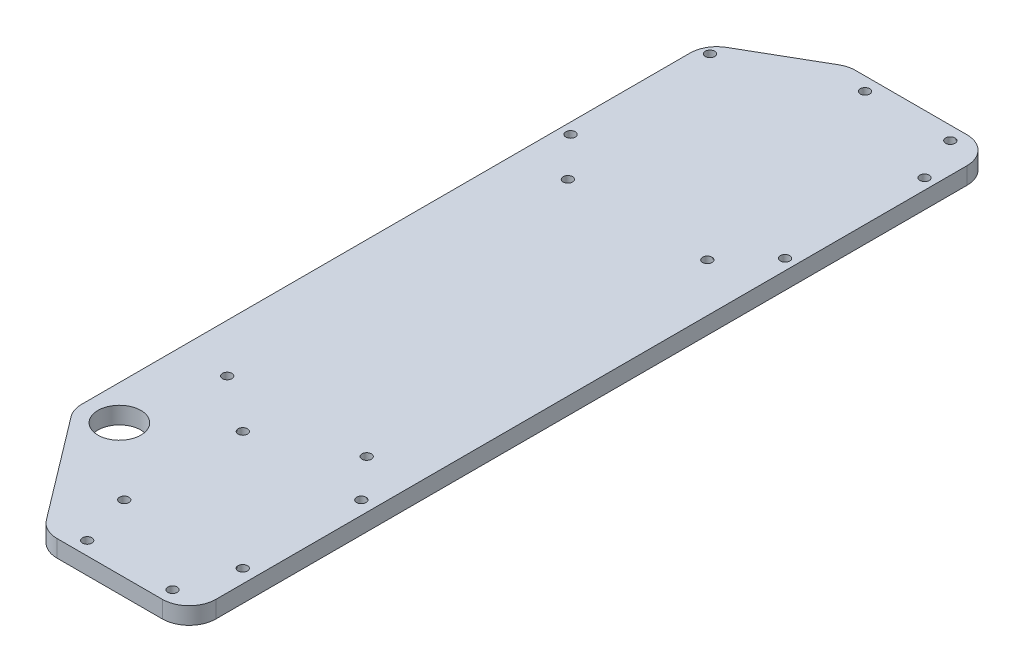
ISO-10303-21;
HEADER;
FILE_DESCRIPTION(('STEP AP214'),'2;1');
FILE_NAME('part.step','',(''),(''),'','','');
FILE_SCHEMA(('AUTOMOTIVE_DESIGN { 1 0 10303 214 1 1 1 1 }'));
ENDSEC;
DATA;
#1=APPLICATION_CONTEXT('core data for automotive mechanical design processes');
#2=APPLICATION_PROTOCOL_DEFINITION('international standard','automotive_design',2000,#1);
#3=PRODUCT_CONTEXT('',#1,'mechanical');
#4=PRODUCT('Part','Part','',(#3));
#5=PRODUCT_RELATED_PRODUCT_CATEGORY('part','',(#4));
#6=PRODUCT_DEFINITION_FORMATION('','',#4);
#7=PRODUCT_DEFINITION_CONTEXT('part definition',#1,'design');
#8=PRODUCT_DEFINITION('design','',#6,#7);
#9=PRODUCT_DEFINITION_SHAPE('','',#8);
#10=(LENGTH_UNIT() NAMED_UNIT(*) SI_UNIT(.MILLI.,.METRE.));
#11=(NAMED_UNIT(*) PLANE_ANGLE_UNIT() SI_UNIT($,.RADIAN.));
#12=(NAMED_UNIT(*) SI_UNIT($,.STERADIAN.) SOLID_ANGLE_UNIT());
#13=UNCERTAINTY_MEASURE_WITH_UNIT(LENGTH_MEASURE(1.E-05),#10,'distance_accuracy_value','');
#14=(GEOMETRIC_REPRESENTATION_CONTEXT(3) GLOBAL_UNCERTAINTY_ASSIGNED_CONTEXT((#13)) GLOBAL_UNIT_ASSIGNED_CONTEXT((#10,
#11,#12)) REPRESENTATION_CONTEXT('',''));
#15=CARTESIAN_POINT('',(0.,0.,0.));
#16=DIRECTION('',(0.,0.,1.));
#17=DIRECTION('',(1.,0.,0.));
#18=AXIS2_PLACEMENT_3D('',#15,#16,#17);
#19=CARTESIAN_POINT('',(0.,6.35,-300.));
#20=DIRECTION('',(0.,0.,-1.));
#21=DIRECTION('',(-1.,0.,0.));
#22=AXIS2_PLACEMENT_3D('',#19,#20,#21);
#23=PLANE('',#22);
#24=DIRECTION('',(1.,0.,0.));
#25=VECTOR('',#24,1.);
#26=CARTESIAN_POINT('',(0.,0.,-300.));
#27=LINE('',#26,#25);
#28=CARTESIAN_POINT('',(36.4764778941574,0.,-300.));
#29=VERTEX_POINT('',#28);
#30=CARTESIAN_POINT('',(78.,0.,-300.));
#31=VERTEX_POINT('',#30);
#32=EDGE_CURVE('E162',#29,#31,#27,.T.);
#33=ORIENTED_EDGE('',*,*,#32,.F.);
#34=DIRECTION('',(0.,-1.,0.));
#35=VECTOR('',#34,1.);
#36=CARTESIAN_POINT('',(36.4764778941574,6.35,-300.));
#37=LINE('',#36,#35);
#38=CARTESIAN_POINT('',(36.4764778941574,6.35,-300.));
#39=VERTEX_POINT('',#38);
#40=EDGE_CURVE('E137',#29,#39,#37,.F.);
#41=ORIENTED_EDGE('',*,*,#40,.T.);
#42=DIRECTION('',(1.,0.,0.));
#43=VECTOR('',#42,1.);
#44=CARTESIAN_POINT('',(0.,6.35,-300.));
#45=LINE('',#44,#43);
#46=CARTESIAN_POINT('',(78.,6.35,-300.));
#47=VERTEX_POINT('',#46);
#48=EDGE_CURVE('E447',#39,#47,#45,.T.);
#49=ORIENTED_EDGE('',*,*,#48,.T.);
#50=DIRECTION('',(0.,-1.,0.));
#51=VECTOR('',#50,1.);
#52=CARTESIAN_POINT('',(78.,0.,-300.));
#53=LINE('',#52,#51);
#54=EDGE_CURVE('E143',#47,#31,#53,.T.);
#55=ORIENTED_EDGE('',*,*,#54,.T.);
#56=EDGE_LOOP('',(#33,#41,#49,#55));
#57=FACE_BOUND('',#56,.T.);
#58=ADVANCED_FACE('F41',(#57),#23,.T.);
#59=CARTESIAN_POINT('',(-121.385817205056,6.35,-210.519771644725));
#60=DIRECTION('',(0.499512809312093,0.,0.86630650080277));
#61=DIRECTION('',(0.86630650080277,0.,-0.499512809312094));
#62=AXIS2_PLACEMENT_3D('',#59,#60,#61);
#63=PLANE('',#62);
#64=DIRECTION('',(-0.86630650080277,0.,0.499512809312094));
#65=VECTOR('',#64,1.);
#66=CARTESIAN_POINT('',(-121.385817205056,6.35,-210.519771644725));
#67=LINE('',#66,#65);
#68=CARTESIAN_POINT('',(31.4813498010365,6.35,-298.663065008028));
#69=VERTEX_POINT('',#68);
#70=CARTESIAN_POINT('',(5.00487190687912,6.35,-283.396713155254));
#71=VERTEX_POINT('',#70);
#72=EDGE_CURVE('E153',#69,#71,#67,.T.);
#73=ORIENTED_EDGE('',*,*,#72,.F.);
#74=DIRECTION('',(0.,-1.,0.));
#75=VECTOR('',#74,1.);
#76=CARTESIAN_POINT('',(31.4813498010365,0.,-298.663065008028));
#77=LINE('',#76,#75);
#78=CARTESIAN_POINT('',(31.4813498010365,0.,-298.663065008028));
#79=VERTEX_POINT('',#78);
#80=EDGE_CURVE('E136',#69,#79,#77,.T.);
#81=ORIENTED_EDGE('',*,*,#80,.T.);
#82=DIRECTION('',(-0.86630650080277,0.,0.499512809312094));
#83=VECTOR('',#82,1.);
#84=CARTESIAN_POINT('',(-121.385817205056,0.,-210.519771644725));
#85=LINE('',#84,#83);
#86=CARTESIAN_POINT('',(5.00487190687912,0.,-283.396713155254));
#87=VERTEX_POINT('',#86);
#88=EDGE_CURVE('E150',#79,#87,#85,.T.);
#89=ORIENTED_EDGE('',*,*,#88,.T.);
#90=DIRECTION('',(0.,-1.,0.));
#91=VECTOR('',#90,1.);
#92=CARTESIAN_POINT('',(5.00487190687907,6.35,-283.396713155254));
#93=LINE('',#92,#91);
#94=EDGE_CURVE('E156',#87,#71,#93,.F.);
#95=ORIENTED_EDGE('',*,*,#94,.T.);
#96=EDGE_LOOP('',(#73,#81,#89,#95));
#97=FACE_BOUND('',#96,.T.);
#98=ADVANCED_FACE('F149',(#97),#63,.F.);
#99=CARTESIAN_POINT('',(0.,6.35,0.));
#100=DIRECTION('',(-1.,0.,0.));
#101=DIRECTION('',(0.,0.,1.));
#102=AXIS2_PLACEMENT_3D('',#99,#100,#101);
#103=PLANE('',#102);
#104=DIRECTION('',(0.,0.,-1.));
#105=VECTOR('',#104,1.);
#106=CARTESIAN_POINT('',(0.,6.35,0.));
#107=LINE('',#106,#105);
#108=CARTESIAN_POINT('',(0.,6.35,-47.9922495753838));
#109=VERTEX_POINT('',#108);
#110=CARTESIAN_POINT('',(0.,6.35,-274.733648147227));
#111=VERTEX_POINT('',#110);
#112=EDGE_CURVE('E268',#109,#111,#107,.T.);
#113=ORIENTED_EDGE('',*,*,#112,.T.);
#114=DIRECTION('',(0.,-1.,0.));
#115=VECTOR('',#114,1.);
#116=CARTESIAN_POINT('',(0.,0.,-274.733648147227));
#117=LINE('',#116,#115);
#118=CARTESIAN_POINT('',(0.,0.,-274.733648147227));
#119=VERTEX_POINT('',#118);
#120=EDGE_CURVE('E224',#111,#119,#117,.T.);
#121=ORIENTED_EDGE('',*,*,#120,.T.);
#122=DIRECTION('',(0.,0.,-1.));
#123=VECTOR('',#122,1.);
#124=CARTESIAN_POINT('',(0.,0.,0.));
#125=LINE('',#124,#123);
#126=CARTESIAN_POINT('',(0.,0.,-47.9922495753838));
#127=VERTEX_POINT('',#126);
#128=EDGE_CURVE('E161',#127,#119,#125,.T.);
#129=ORIENTED_EDGE('',*,*,#128,.F.);
#130=DIRECTION('',(0.,-1.,0.));
#131=VECTOR('',#130,1.);
#132=CARTESIAN_POINT('',(0.,6.35,-47.9922495753838));
#133=LINE('',#132,#131);
#134=EDGE_CURVE('E221',#127,#109,#133,.F.);
#135=ORIENTED_EDGE('',*,*,#134,.T.);
#136=EDGE_LOOP('',(#113,#121,#129,#135));
#137=FACE_BOUND('',#136,.T.);
#138=ADVANCED_FACE('F360',(#137),#103,.T.);
#139=CARTESIAN_POINT('',(21.481023492821,6.35,-16.267274626016));
#140=DIRECTION('',(-0.797203386490908,0.,0.603710825285937));
#141=DIRECTION('',(0.603710825285937,0.,0.797203386490908));
#142=AXIS2_PLACEMENT_3D('',#139,#140,#141);
#143=PLANE('',#142);
#144=DIRECTION('',(-0.603710825285937,0.,-0.797203386490908));
#145=VECTOR('',#144,1.);
#146=CARTESIAN_POINT('',(21.481023492821,0.,-16.267274626016));
#147=LINE('',#146,#145);
#148=CARTESIAN_POINT('',(30.7989582486396,0.,-3.96289174714063));
#149=VERTEX_POINT('',#148);
#150=CARTESIAN_POINT('',(2.02796613509092,0.,-41.9551413225245));
#151=VERTEX_POINT('',#150);
#152=EDGE_CURVE('E166',#149,#151,#147,.T.);
#153=ORIENTED_EDGE('',*,*,#152,.F.);
#154=DIRECTION('',(0.,-1.,0.));
#155=VECTOR('',#154,1.);
#156=CARTESIAN_POINT('',(30.7989582486396,6.35,-3.96289174714063));
#157=LINE('',#156,#155);
#158=CARTESIAN_POINT('',(30.7989582486396,6.35,-3.96289174714063));
#159=VERTEX_POINT('',#158);
#160=EDGE_CURVE('E11',#149,#159,#157,.F.);
#161=ORIENTED_EDGE('',*,*,#160,.T.);
#162=DIRECTION('',(-0.603710825285937,0.,-0.797203386490908));
#163=VECTOR('',#162,1.);
#164=CARTESIAN_POINT('',(21.481023492821,6.35,-16.267274626016));
#165=LINE('',#164,#163);
#166=CARTESIAN_POINT('',(2.02796613509092,6.35,-41.9551413225245));
#167=VERTEX_POINT('',#166);
#168=EDGE_CURVE('E249',#159,#167,#165,.T.);
#169=ORIENTED_EDGE('',*,*,#168,.T.);
#170=DIRECTION('',(0.,-1.,0.));
#171=VECTOR('',#170,1.);
#172=CARTESIAN_POINT('',(2.02796613509092,6.35,-41.9551413225245));
#173=LINE('',#172,#171);
#174=EDGE_CURVE('E50',#167,#151,#173,.T.);
#175=ORIENTED_EDGE('',*,*,#174,.T.);
#176=EDGE_LOOP('',(#153,#161,#169,#175));
#177=FACE_BOUND('',#176,.T.);
#178=ADVANCED_FACE('F246',(#177),#143,.T.);
#179=CARTESIAN_POINT('',(0.,6.35,0.));
#180=DIRECTION('',(0.,0.,-1.));
#181=DIRECTION('',(-1.,0.,0.));
#182=AXIS2_PLACEMENT_3D('',#179,#180,#181);
#183=PLANE('',#182);
#184=DIRECTION('',(1.,0.,0.));
#185=VECTOR('',#184,1.);
#186=CARTESIAN_POINT('',(0.,0.,0.));
#187=LINE('',#186,#185);
#188=CARTESIAN_POINT('',(38.7709921135487,0.,0.));
#189=VERTEX_POINT('',#188);
#190=CARTESIAN_POINT('',(78.,0.,0.));
#191=VERTEX_POINT('',#190);
#192=EDGE_CURVE('E175',#189,#191,#187,.T.);
#193=ORIENTED_EDGE('',*,*,#192,.T.);
#194=DIRECTION('',(0.,-1.,0.));
#195=VECTOR('',#194,1.);
#196=CARTESIAN_POINT('',(78.,6.35,0.));
#197=LINE('',#196,#195);
#198=CARTESIAN_POINT('',(78.,6.35,0.));
#199=VERTEX_POINT('',#198);
#200=EDGE_CURVE('E238',#191,#199,#197,.F.);
#201=ORIENTED_EDGE('',*,*,#200,.T.);
#202=DIRECTION('',(1.,0.,0.));
#203=VECTOR('',#202,1.);
#204=CARTESIAN_POINT('',(0.,6.35,0.));
#205=LINE('',#204,#203);
#206=CARTESIAN_POINT('',(38.7709921135487,6.35,0.));
#207=VERTEX_POINT('',#206);
#208=EDGE_CURVE('E262',#207,#199,#205,.T.);
#209=ORIENTED_EDGE('',*,*,#208,.F.);
#210=DIRECTION('',(0.,-1.,0.));
#211=VECTOR('',#210,1.);
#212=CARTESIAN_POINT('',(38.7709921135487,0.,0.));
#213=LINE('',#212,#211);
#214=EDGE_CURVE('E234',#207,#189,#213,.T.);
#215=ORIENTED_EDGE('',*,*,#214,.T.);
#216=EDGE_LOOP('',(#193,#201,#209,#215));
#217=FACE_BOUND('',#216,.T.);
#218=ADVANCED_FACE('F260',(#217),#183,.F.);
#219=CARTESIAN_POINT('',(18.,6.35,-211.2));
#220=DIRECTION('',(0.,-1.,0.));
#221=DIRECTION('',(0.,0.,-1.));
#222=AXIS2_PLACEMENT_3D('',#219,#220,#221);
#223=CYLINDRICAL_SURFACE('',#222,1.75);
#224=CARTESIAN_POINT('',(18.,6.35,-211.2));
#225=DIRECTION('',(0.,1.,0.));
#226=DIRECTION('',(0.,0.,1.));
#227=AXIS2_PLACEMENT_3D('',#224,#225,#226);
#228=CIRCLE('',#227,1.75);
#229=CARTESIAN_POINT('',(18.,6.35,-209.45));
#230=VERTEX_POINT('',#229);
#231=EDGE_CURVE('E444',#230,#230,#228,.T.);
#232=ORIENTED_EDGE('',*,*,#231,.T.);
#233=EDGE_LOOP('',(#232));
#234=FACE_BOUND('',#233,.T.);
#235=CARTESIAN_POINT('',(18.,0.,-211.2));
#236=DIRECTION('',(0.,1.,0.));
#237=DIRECTION('',(0.,0.,1.));
#238=AXIS2_PLACEMENT_3D('',#235,#236,#237);
#239=CIRCLE('',#238,1.75);
#240=CARTESIAN_POINT('',(18.,0.,-209.45));
#241=VERTEX_POINT('',#240);
#242=EDGE_CURVE('E168',#241,#241,#239,.T.);
#243=ORIENTED_EDGE('',*,*,#242,.F.);
#244=EDGE_LOOP('',(#243));
#245=FACE_BOUND('',#244,.T.);
#246=ADVANCED_FACE('F340',(#234,#245),#223,.F.);
#247=CARTESIAN_POINT('',(70.,6.35,-84.2));
#248=DIRECTION('',(0.,-1.,0.));
#249=DIRECTION('',(0.,0.,-1.));
#250=AXIS2_PLACEMENT_3D('',#247,#248,#249);
#251=CYLINDRICAL_SURFACE('',#250,1.75);
#252=CARTESIAN_POINT('',(70.,6.35,-84.2));
#253=DIRECTION('',(0.,1.,0.));
#254=DIRECTION('',(0.,0.,1.));
#255=AXIS2_PLACEMENT_3D('',#252,#253,#254);
#256=CIRCLE('',#255,1.75);
#257=CARTESIAN_POINT('',(70.,6.35,-82.45));
#258=VERTEX_POINT('',#257);
#259=EDGE_CURVE('E442',#258,#258,#256,.T.);
#260=ORIENTED_EDGE('',*,*,#259,.T.);
#261=EDGE_LOOP('',(#260));
#262=FACE_BOUND('',#261,.T.);
#263=CARTESIAN_POINT('',(70.,0.,-84.2));
#264=DIRECTION('',(0.,1.,0.));
#265=DIRECTION('',(0.,0.,1.));
#266=AXIS2_PLACEMENT_3D('',#263,#264,#265);
#267=CIRCLE('',#266,1.75);
#268=CARTESIAN_POINT('',(70.,0.,-82.45));
#269=VERTEX_POINT('',#268);
#270=EDGE_CURVE('E332',#269,#269,#267,.T.);
#271=ORIENTED_EDGE('',*,*,#270,.F.);
#272=EDGE_LOOP('',(#271));
#273=FACE_BOUND('',#272,.T.);
#274=ADVANCED_FACE('F342',(#262,#273),#251,.F.);
#275=CARTESIAN_POINT('',(18.,6.35,-84.2));
#276=DIRECTION('',(0.,-1.,0.));
#277=DIRECTION('',(0.,0.,-1.));
#278=AXIS2_PLACEMENT_3D('',#275,#276,#277);
#279=CYLINDRICAL_SURFACE('',#278,1.75);
#280=CARTESIAN_POINT('',(18.,6.35,-84.2));
#281=DIRECTION('',(0.,1.,0.));
#282=DIRECTION('',(0.,0.,1.));
#283=AXIS2_PLACEMENT_3D('',#280,#281,#282);
#284=CIRCLE('',#283,1.75);
#285=CARTESIAN_POINT('',(18.,6.35,-82.45));
#286=VERTEX_POINT('',#285);
#287=EDGE_CURVE('E438',#286,#286,#284,.T.);
#288=ORIENTED_EDGE('',*,*,#287,.T.);
#289=EDGE_LOOP('',(#288));
#290=FACE_BOUND('',#289,.T.);
#291=CARTESIAN_POINT('',(18.,0.,-84.2));
#292=DIRECTION('',(0.,1.,0.));
#293=DIRECTION('',(0.,0.,1.));
#294=AXIS2_PLACEMENT_3D('',#291,#292,#293);
#295=CIRCLE('',#294,1.75);
#296=CARTESIAN_POINT('',(18.,0.,-82.45));
#297=VERTEX_POINT('',#296);
#298=EDGE_CURVE('E328',#297,#297,#295,.T.);
#299=ORIENTED_EDGE('',*,*,#298,.F.);
#300=EDGE_LOOP('',(#299));
#301=FACE_BOUND('',#300,.T.);
#302=ADVANCED_FACE('F349',(#290,#301),#279,.F.);
#303=CARTESIAN_POINT('',(70.,6.35,-211.2));
#304=DIRECTION('',(0.,-1.,0.));
#305=DIRECTION('',(0.,0.,-1.));
#306=AXIS2_PLACEMENT_3D('',#303,#304,#305);
#307=CYLINDRICAL_SURFACE('',#306,1.75);
#308=CARTESIAN_POINT('',(70.,6.35,-211.2));
#309=DIRECTION('',(0.,1.,0.));
#310=DIRECTION('',(0.,0.,1.));
#311=AXIS2_PLACEMENT_3D('',#308,#309,#310);
#312=CIRCLE('',#311,1.75);
#313=CARTESIAN_POINT('',(70.,6.35,-209.45));
#314=VERTEX_POINT('',#313);
#315=EDGE_CURVE('E434',#314,#314,#312,.T.);
#316=ORIENTED_EDGE('',*,*,#315,.T.);
#317=EDGE_LOOP('',(#316));
#318=FACE_BOUND('',#317,.T.);
#319=CARTESIAN_POINT('',(70.,0.,-211.2));
#320=DIRECTION('',(0.,1.,0.));
#321=DIRECTION('',(0.,0.,1.));
#322=AXIS2_PLACEMENT_3D('',#319,#320,#321);
#323=CIRCLE('',#322,1.75);
#324=CARTESIAN_POINT('',(70.,0.,-209.45));
#325=VERTEX_POINT('',#324);
#326=EDGE_CURVE('E324',#325,#325,#323,.T.);
#327=ORIENTED_EDGE('',*,*,#326,.F.);
#328=EDGE_LOOP('',(#327));
#329=FACE_BOUND('',#328,.T.);
#330=ADVANCED_FACE('F685',(#318,#329),#307,.F.);
#331=CARTESIAN_POINT('',(4.,6.35,-278.2));
#332=DIRECTION('',(0.,-1.,0.));
#333=DIRECTION('',(0.,0.,-1.));
#334=AXIS2_PLACEMENT_3D('',#331,#332,#333);
#335=CYLINDRICAL_SURFACE('',#334,1.75);
#336=CARTESIAN_POINT('',(4.,6.35,-278.2));
#337=DIRECTION('',(0.,1.,0.));
#338=DIRECTION('',(0.,0.,1.));
#339=AXIS2_PLACEMENT_3D('',#336,#337,#338);
#340=CIRCLE('',#339,1.75);
#341=CARTESIAN_POINT('',(4.,6.35,-276.45));
#342=VERTEX_POINT('',#341);
#343=EDGE_CURVE('E430',#342,#342,#340,.T.);
#344=ORIENTED_EDGE('',*,*,#343,.T.);
#345=EDGE_LOOP('',(#344));
#346=FACE_BOUND('',#345,.T.);
#347=CARTESIAN_POINT('',(4.,0.,-278.2));
#348=DIRECTION('',(0.,1.,0.));
#349=DIRECTION('',(0.,0.,1.));
#350=AXIS2_PLACEMENT_3D('',#347,#348,#349);
#351=CIRCLE('',#350,1.75);
#352=CARTESIAN_POINT('',(4.,0.,-276.45));
#353=VERTEX_POINT('',#352);
#354=EDGE_CURVE('E320',#353,#353,#351,.T.);
#355=ORIENTED_EDGE('',*,*,#354,.F.);
#356=EDGE_LOOP('',(#355));
#357=FACE_BOUND('',#356,.T.);
#358=ADVANCED_FACE('F675',(#346,#357),#335,.F.);
#359=CARTESIAN_POINT('',(4.,6.35,-226.2));
#360=DIRECTION('',(0.,-1.,0.));
#361=DIRECTION('',(0.,0.,-1.));
#362=AXIS2_PLACEMENT_3D('',#359,#360,#361);
#363=CYLINDRICAL_SURFACE('',#362,1.75);
#364=CARTESIAN_POINT('',(4.,6.35,-226.2));
#365=DIRECTION('',(0.,1.,0.));
#366=DIRECTION('',(0.,0.,1.));
#367=AXIS2_PLACEMENT_3D('',#364,#365,#366);
#368=CIRCLE('',#367,1.75);
#369=CARTESIAN_POINT('',(4.,6.35,-224.45));
#370=VERTEX_POINT('',#369);
#371=EDGE_CURVE('E426',#370,#370,#368,.T.);
#372=ORIENTED_EDGE('',*,*,#371,.T.);
#373=EDGE_LOOP('',(#372));
#374=FACE_BOUND('',#373,.T.);
#375=CARTESIAN_POINT('',(4.,0.,-226.2));
#376=DIRECTION('',(0.,1.,0.));
#377=DIRECTION('',(0.,0.,1.));
#378=AXIS2_PLACEMENT_3D('',#375,#376,#377);
#379=CIRCLE('',#378,1.75);
#380=CARTESIAN_POINT('',(4.,0.,-224.45));
#381=VERTEX_POINT('',#380);
#382=EDGE_CURVE('E316',#381,#381,#379,.T.);
#383=ORIENTED_EDGE('',*,*,#382,.F.);
#384=EDGE_LOOP('',(#383));
#385=FACE_BOUND('',#384,.T.);
#386=ADVANCED_FACE('F665',(#374,#385),#363,.F.);
#387=CARTESIAN_POINT('',(84.,6.35,-226.2));
#388=DIRECTION('',(0.,-1.,0.));
#389=DIRECTION('',(0.,0.,-1.));
#390=AXIS2_PLACEMENT_3D('',#387,#388,#389);
#391=CYLINDRICAL_SURFACE('',#390,1.75);
#392=CARTESIAN_POINT('',(84.,6.35,-226.2));
#393=DIRECTION('',(0.,1.,0.));
#394=DIRECTION('',(0.,0.,1.));
#395=AXIS2_PLACEMENT_3D('',#392,#393,#394);
#396=CIRCLE('',#395,1.75);
#397=CARTESIAN_POINT('',(84.,6.35,-224.45));
#398=VERTEX_POINT('',#397);
#399=EDGE_CURVE('E422',#398,#398,#396,.T.);
#400=ORIENTED_EDGE('',*,*,#399,.T.);
#401=EDGE_LOOP('',(#400));
#402=FACE_BOUND('',#401,.T.);
#403=CARTESIAN_POINT('',(84.,0.,-226.2));
#404=DIRECTION('',(0.,1.,0.));
#405=DIRECTION('',(0.,0.,1.));
#406=AXIS2_PLACEMENT_3D('',#403,#404,#405);
#407=CIRCLE('',#406,1.75);
#408=CARTESIAN_POINT('',(84.,0.,-224.45));
#409=VERTEX_POINT('',#408);
#410=EDGE_CURVE('E312',#409,#409,#407,.T.);
#411=ORIENTED_EDGE('',*,*,#410,.F.);
#412=EDGE_LOOP('',(#411));
#413=FACE_BOUND('',#412,.T.);
#414=ADVANCED_FACE('F655',(#402,#413),#391,.F.);
#415=CARTESIAN_POINT('',(84.,6.35,-278.2));
#416=DIRECTION('',(0.,-1.,0.));
#417=DIRECTION('',(0.,0.,-1.));
#418=AXIS2_PLACEMENT_3D('',#415,#416,#417);
#419=CYLINDRICAL_SURFACE('',#418,1.75);
#420=CARTESIAN_POINT('',(84.,6.35,-278.2));
#421=DIRECTION('',(0.,1.,0.));
#422=DIRECTION('',(0.,0.,1.));
#423=AXIS2_PLACEMENT_3D('',#420,#421,#422);
#424=CIRCLE('',#423,1.75);
#425=CARTESIAN_POINT('',(84.,6.35,-276.45));
#426=VERTEX_POINT('',#425);
#427=EDGE_CURVE('E418',#426,#426,#424,.T.);
#428=ORIENTED_EDGE('',*,*,#427,.T.);
#429=EDGE_LOOP('',(#428));
#430=FACE_BOUND('',#429,.T.);
#431=CARTESIAN_POINT('',(84.,0.,-278.2));
#432=DIRECTION('',(0.,1.,0.));
#433=DIRECTION('',(0.,0.,1.));
#434=AXIS2_PLACEMENT_3D('',#431,#432,#433);
#435=CIRCLE('',#434,1.75);
#436=CARTESIAN_POINT('',(84.,0.,-276.45));
#437=VERTEX_POINT('',#436);
#438=EDGE_CURVE('E308',#437,#437,#435,.T.);
#439=ORIENTED_EDGE('',*,*,#438,.F.);
#440=EDGE_LOOP('',(#439));
#441=FACE_BOUND('',#440,.T.);
#442=ADVANCED_FACE('F645',(#430,#441),#419,.F.);
#443=CARTESIAN_POINT('',(38.8,6.35,-69.2));
#444=DIRECTION('',(0.,-1.,0.));
#445=DIRECTION('',(0.,0.,-1.));
#446=AXIS2_PLACEMENT_3D('',#443,#444,#445);
#447=CYLINDRICAL_SURFACE('',#446,1.75);
#448=CARTESIAN_POINT('',(38.8,6.35,-69.2));
#449=DIRECTION('',(0.,1.,0.));
#450=DIRECTION('',(0.,0.,1.));
#451=AXIS2_PLACEMENT_3D('',#448,#449,#450);
#452=CIRCLE('',#451,1.75);
#453=CARTESIAN_POINT('',(38.8,6.35,-67.45));
#454=VERTEX_POINT('',#453);
#455=EDGE_CURVE('E414',#454,#454,#452,.T.);
#456=ORIENTED_EDGE('',*,*,#455,.T.);
#457=EDGE_LOOP('',(#456));
#458=FACE_BOUND('',#457,.T.);
#459=CARTESIAN_POINT('',(38.8,0.,-69.2));
#460=DIRECTION('',(0.,1.,0.));
#461=DIRECTION('',(0.,0.,1.));
#462=AXIS2_PLACEMENT_3D('',#459,#460,#461);
#463=CIRCLE('',#462,1.75);
#464=CARTESIAN_POINT('',(38.8,0.,-67.45));
#465=VERTEX_POINT('',#464);
#466=EDGE_CURVE('E304',#465,#465,#463,.T.);
#467=ORIENTED_EDGE('',*,*,#466,.F.);
#468=EDGE_LOOP('',(#467));
#469=FACE_BOUND('',#468,.T.);
#470=ADVANCED_FACE('F635',(#458,#469),#447,.F.);
#471=CARTESIAN_POINT('',(83.,6.35,-69.2));
#472=DIRECTION('',(0.,-1.,0.));
#473=DIRECTION('',(0.,0.,-1.));
#474=AXIS2_PLACEMENT_3D('',#471,#472,#473);
#475=CYLINDRICAL_SURFACE('',#474,1.75);
#476=CARTESIAN_POINT('',(83.,6.35,-69.2));
#477=DIRECTION('',(0.,1.,0.));
#478=DIRECTION('',(0.,0.,1.));
#479=AXIS2_PLACEMENT_3D('',#476,#477,#478);
#480=CIRCLE('',#479,1.75);
#481=CARTESIAN_POINT('',(83.,6.35,-67.45));
#482=VERTEX_POINT('',#481);
#483=EDGE_CURVE('E410',#482,#482,#480,.T.);
#484=ORIENTED_EDGE('',*,*,#483,.T.);
#485=EDGE_LOOP('',(#484));
#486=FACE_BOUND('',#485,.T.);
#487=CARTESIAN_POINT('',(83.,0.,-69.2));
#488=DIRECTION('',(0.,1.,0.));
#489=DIRECTION('',(0.,0.,1.));
#490=AXIS2_PLACEMENT_3D('',#487,#488,#489);
#491=CIRCLE('',#490,1.75);
#492=CARTESIAN_POINT('',(83.,0.,-67.45));
#493=VERTEX_POINT('',#492);
#494=EDGE_CURVE('E300',#493,#493,#491,.T.);
#495=ORIENTED_EDGE('',*,*,#494,.F.);
#496=EDGE_LOOP('',(#495));
#497=FACE_BOUND('',#496,.T.);
#498=ADVANCED_FACE('F625',(#486,#497),#475,.F.);
#499=CARTESIAN_POINT('',(83.,6.35,-25.));
#500=DIRECTION('',(0.,-1.,0.));
#501=DIRECTION('',(0.,0.,-1.));
#502=AXIS2_PLACEMENT_3D('',#499,#500,#501);
#503=CYLINDRICAL_SURFACE('',#502,1.74999999999998);
#504=CARTESIAN_POINT('',(83.,6.35,-25.));
#505=DIRECTION('',(0.,1.,0.));
#506=DIRECTION('',(0.,0.,1.));
#507=AXIS2_PLACEMENT_3D('',#504,#505,#506);
#508=CIRCLE('',#507,1.74999999999998);
#509=CARTESIAN_POINT('',(83.,6.35,-23.25));
#510=VERTEX_POINT('',#509);
#511=EDGE_CURVE('E406',#510,#510,#508,.T.);
#512=ORIENTED_EDGE('',*,*,#511,.T.);
#513=EDGE_LOOP('',(#512));
#514=FACE_BOUND('',#513,.T.);
#515=CARTESIAN_POINT('',(83.,0.,-25.));
#516=DIRECTION('',(0.,1.,0.));
#517=DIRECTION('',(0.,0.,1.));
#518=AXIS2_PLACEMENT_3D('',#515,#516,#517);
#519=CIRCLE('',#518,1.74999999999998);
#520=CARTESIAN_POINT('',(83.,0.,-23.25));
#521=VERTEX_POINT('',#520);
#522=EDGE_CURVE('E296',#521,#521,#519,.T.);
#523=ORIENTED_EDGE('',*,*,#522,.F.);
#524=EDGE_LOOP('',(#523));
#525=FACE_BOUND('',#524,.T.);
#526=ADVANCED_FACE('F615',(#514,#525),#503,.F.);
#527=CARTESIAN_POINT('',(38.8,6.35,-25.));
#528=DIRECTION('',(0.,-1.,0.));
#529=DIRECTION('',(0.,0.,-1.));
#530=AXIS2_PLACEMENT_3D('',#527,#528,#529);
#531=CYLINDRICAL_SURFACE('',#530,1.75000000000001);
#532=CARTESIAN_POINT('',(38.8,6.35,-25.));
#533=DIRECTION('',(0.,1.,0.));
#534=DIRECTION('',(0.,0.,1.));
#535=AXIS2_PLACEMENT_3D('',#532,#533,#534);
#536=CIRCLE('',#535,1.75000000000001);
#537=CARTESIAN_POINT('',(38.8,6.35,-23.25));
#538=VERTEX_POINT('',#537);
#539=EDGE_CURVE('E402',#538,#538,#536,.T.);
#540=ORIENTED_EDGE('',*,*,#539,.T.);
#541=EDGE_LOOP('',(#540));
#542=FACE_BOUND('',#541,.T.);
#543=CARTESIAN_POINT('',(38.8,0.,-25.));
#544=DIRECTION('',(0.,1.,0.));
#545=DIRECTION('',(0.,0.,1.));
#546=AXIS2_PLACEMENT_3D('',#543,#544,#545);
#547=CIRCLE('',#546,1.75000000000001);
#548=CARTESIAN_POINT('',(38.8,0.,-23.25));
#549=VERTEX_POINT('',#548);
#550=EDGE_CURVE('E292',#549,#549,#547,.T.);
#551=ORIENTED_EDGE('',*,*,#550,.F.);
#552=EDGE_LOOP('',(#551));
#553=FACE_BOUND('',#552,.T.);
#554=ADVANCED_FACE('F605',(#542,#553),#531,.F.);
#555=CARTESIAN_POINT('',(45.,6.35,-295.));
#556=DIRECTION('',(0.,-1.,0.));
#557=DIRECTION('',(0.,0.,-1.));
#558=AXIS2_PLACEMENT_3D('',#555,#556,#557);
#559=CYLINDRICAL_SURFACE('',#558,1.75);
#560=CARTESIAN_POINT('',(45.,6.35,-295.));
#561=DIRECTION('',(0.,1.,0.));
#562=DIRECTION('',(0.,0.,1.));
#563=AXIS2_PLACEMENT_3D('',#560,#561,#562);
#564=CIRCLE('',#563,1.75);
#565=CARTESIAN_POINT('',(45.,6.35,-293.25));
#566=VERTEX_POINT('',#565);
#567=EDGE_CURVE('E398',#566,#566,#564,.T.);
#568=ORIENTED_EDGE('',*,*,#567,.T.);
#569=EDGE_LOOP('',(#568));
#570=FACE_BOUND('',#569,.T.);
#571=CARTESIAN_POINT('',(45.,0.,-295.));
#572=DIRECTION('',(0.,1.,0.));
#573=DIRECTION('',(0.,0.,1.));
#574=AXIS2_PLACEMENT_3D('',#571,#572,#573);
#575=CIRCLE('',#574,1.75);
#576=CARTESIAN_POINT('',(45.,0.,-293.25));
#577=VERTEX_POINT('',#576);
#578=EDGE_CURVE('E288',#577,#577,#575,.T.);
#579=ORIENTED_EDGE('',*,*,#578,.F.);
#580=EDGE_LOOP('',(#579));
#581=FACE_BOUND('',#580,.T.);
#582=ADVANCED_FACE('F595',(#570,#581),#559,.F.);
#583=CARTESIAN_POINT('',(76.8,6.35,-295.));
#584=DIRECTION('',(0.,-1.,0.));
#585=DIRECTION('',(0.,0.,-1.));
#586=AXIS2_PLACEMENT_3D('',#583,#584,#585);
#587=CYLINDRICAL_SURFACE('',#586,1.75);
#588=CARTESIAN_POINT('',(76.8,6.35,-295.));
#589=DIRECTION('',(0.,1.,0.));
#590=DIRECTION('',(0.,0.,1.));
#591=AXIS2_PLACEMENT_3D('',#588,#589,#590);
#592=CIRCLE('',#591,1.75);
#593=CARTESIAN_POINT('',(76.8,6.35,-293.25));
#594=VERTEX_POINT('',#593);
#595=EDGE_CURVE('E394',#594,#594,#592,.T.);
#596=ORIENTED_EDGE('',*,*,#595,.T.);
#597=EDGE_LOOP('',(#596));
#598=FACE_BOUND('',#597,.T.);
#599=CARTESIAN_POINT('',(76.8,0.,-295.));
#600=DIRECTION('',(0.,1.,0.));
#601=DIRECTION('',(0.,0.,1.));
#602=AXIS2_PLACEMENT_3D('',#599,#600,#601);
#603=CIRCLE('',#602,1.75);
#604=CARTESIAN_POINT('',(76.8,0.,-293.25));
#605=VERTEX_POINT('',#604);
#606=EDGE_CURVE('E284',#605,#605,#603,.T.);
#607=ORIENTED_EDGE('',*,*,#606,.F.);
#608=EDGE_LOOP('',(#607));
#609=FACE_BOUND('',#608,.T.);
#610=ADVANCED_FACE('F585',(#598,#609),#587,.F.);
#611=CARTESIAN_POINT('',(45.,6.35,-5.));
#612=DIRECTION('',(0.,-1.,0.));
#613=DIRECTION('',(0.,0.,-1.));
#614=AXIS2_PLACEMENT_3D('',#611,#612,#613);
#615=CYLINDRICAL_SURFACE('',#614,1.75);
#616=CARTESIAN_POINT('',(45.,6.35,-5.));
#617=DIRECTION('',(0.,1.,0.));
#618=DIRECTION('',(0.,0.,1.));
#619=AXIS2_PLACEMENT_3D('',#616,#617,#618);
#620=CIRCLE('',#619,1.75);
#621=CARTESIAN_POINT('',(45.,6.35,-3.25));
#622=VERTEX_POINT('',#621);
#623=EDGE_CURVE('E390',#622,#622,#620,.T.);
#624=ORIENTED_EDGE('',*,*,#623,.T.);
#625=EDGE_LOOP('',(#624));
#626=FACE_BOUND('',#625,.T.);
#627=CARTESIAN_POINT('',(45.,0.,-5.));
#628=DIRECTION('',(0.,1.,0.));
#629=DIRECTION('',(0.,0.,1.));
#630=AXIS2_PLACEMENT_3D('',#627,#628,#629);
#631=CIRCLE('',#630,1.75);
#632=CARTESIAN_POINT('',(45.,0.,-3.25));
#633=VERTEX_POINT('',#632);
#634=EDGE_CURVE('E280',#633,#633,#631,.T.);
#635=ORIENTED_EDGE('',*,*,#634,.F.);
#636=EDGE_LOOP('',(#635));
#637=FACE_BOUND('',#636,.T.);
#638=ADVANCED_FACE('F575',(#626,#637),#615,.F.);
#639=CARTESIAN_POINT('',(76.8,6.35,-5.));
#640=DIRECTION('',(0.,-1.,0.));
#641=DIRECTION('',(0.,0.,-1.));
#642=AXIS2_PLACEMENT_3D('',#639,#640,#641);
#643=CYLINDRICAL_SURFACE('',#642,1.75);
#644=CARTESIAN_POINT('',(76.8,6.35,-5.));
#645=DIRECTION('',(0.,1.,0.));
#646=DIRECTION('',(0.,0.,1.));
#647=AXIS2_PLACEMENT_3D('',#644,#645,#646);
#648=CIRCLE('',#647,1.75);
#649=CARTESIAN_POINT('',(76.8,6.35,-3.25));
#650=VERTEX_POINT('',#649);
#651=EDGE_CURVE('E386',#650,#650,#648,.T.);
#652=ORIENTED_EDGE('',*,*,#651,.T.);
#653=EDGE_LOOP('',(#652));
#654=FACE_BOUND('',#653,.T.);
#655=CARTESIAN_POINT('',(76.8,0.,-5.));
#656=DIRECTION('',(0.,1.,0.));
#657=DIRECTION('',(0.,0.,1.));
#658=AXIS2_PLACEMENT_3D('',#655,#656,#657);
#659=CIRCLE('',#658,1.75);
#660=CARTESIAN_POINT('',(76.8,0.,-3.25));
#661=VERTEX_POINT('',#660);
#662=EDGE_CURVE('E276',#661,#661,#659,.T.);
#663=ORIENTED_EDGE('',*,*,#662,.F.);
#664=EDGE_LOOP('',(#663));
#665=FACE_BOUND('',#664,.T.);
#666=ADVANCED_FACE('F566',(#654,#665),#643,.F.);
#667=CARTESIAN_POINT('',(13.,6.35,-49.));
#668=DIRECTION('',(0.,-1.,0.));
#669=DIRECTION('',(0.,0.,-1.));
#670=AXIS2_PLACEMENT_3D('',#667,#668,#669);
#671=CYLINDRICAL_SURFACE('',#670,8.);
#672=CARTESIAN_POINT('',(13.,6.35,-49.));
#673=DIRECTION('',(0.,1.,0.));
#674=DIRECTION('',(0.,0.,1.));
#675=AXIS2_PLACEMENT_3D('',#672,#673,#674);
#676=CIRCLE('',#675,8.);
#677=CARTESIAN_POINT('',(13.,6.35,-41.));
#678=VERTEX_POINT('',#677);
#679=EDGE_CURVE('E182',#678,#678,#676,.T.);
#680=ORIENTED_EDGE('',*,*,#679,.T.);
#681=EDGE_LOOP('',(#680));
#682=FACE_BOUND('',#681,.T.);
#683=CARTESIAN_POINT('',(13.,0.,-49.));
#684=DIRECTION('',(0.,1.,0.));
#685=DIRECTION('',(0.,0.,1.));
#686=AXIS2_PLACEMENT_3D('',#683,#684,#685);
#687=CIRCLE('',#686,8.);
#688=CARTESIAN_POINT('',(13.,0.,-41.));
#689=VERTEX_POINT('',#688);
#690=EDGE_CURVE('E272',#689,#689,#687,.T.);
#691=ORIENTED_EDGE('',*,*,#690,.F.);
#692=EDGE_LOOP('',(#691));
#693=FACE_BOUND('',#692,.T.);
#694=ADVANCED_FACE('F372',(#682,#693),#671,.F.);
#695=CARTESIAN_POINT('',(88.,6.35,0.));
#696=DIRECTION('',(-1.,0.,0.));
#697=DIRECTION('',(0.,0.,1.));
#698=AXIS2_PLACEMENT_3D('',#695,#696,#697);
#699=PLANE('',#698);
#700=DIRECTION('',(0.,0.,-1.));
#701=VECTOR('',#700,1.);
#702=CARTESIAN_POINT('',(88.,0.,0.));
#703=LINE('',#702,#701);
#704=CARTESIAN_POINT('',(88.,0.,-10.));
#705=VERTEX_POINT('',#704);
#706=CARTESIAN_POINT('',(88.,0.,-290.));
#707=VERTEX_POINT('',#706);
#708=EDGE_CURVE('E179',#705,#707,#703,.T.);
#709=ORIENTED_EDGE('',*,*,#708,.T.);
#710=DIRECTION('',(0.,-1.,0.));
#711=VECTOR('',#710,1.);
#712=CARTESIAN_POINT('',(88.,6.35,-290.));
#713=LINE('',#712,#711);
#714=CARTESIAN_POINT('',(88.,6.35,-290.));
#715=VERTEX_POINT('',#714);
#716=EDGE_CURVE('E57',#707,#715,#713,.F.);
#717=ORIENTED_EDGE('',*,*,#716,.T.);
#718=DIRECTION('',(0.,0.,-1.));
#719=VECTOR('',#718,1.);
#720=CARTESIAN_POINT('',(88.,6.35,0.));
#721=LINE('',#720,#719);
#722=CARTESIAN_POINT('',(88.,6.35,-10.));
#723=VERTEX_POINT('',#722);
#724=EDGE_CURVE('E184',#723,#715,#721,.T.);
#725=ORIENTED_EDGE('',*,*,#724,.F.);
#726=DIRECTION('',(0.,-1.,0.));
#727=VECTOR('',#726,1.);
#728=CARTESIAN_POINT('',(88.,6.35,-10.));
#729=LINE('',#728,#727);
#730=EDGE_CURVE('E228',#723,#705,#729,.T.);
#731=ORIENTED_EDGE('',*,*,#730,.T.);
#732=EDGE_LOOP('',(#709,#717,#725,#731));
#733=FACE_BOUND('',#732,.T.);
#734=ADVANCED_FACE('F368',(#733),#699,.F.);
#735=CARTESIAN_POINT('',(0.,6.35,0.));
#736=DIRECTION('',(0.,1.,0.));
#737=DIRECTION('',(0.,0.,1.));
#738=AXIS2_PLACEMENT_3D('',#735,#736,#737);
#739=PLANE('',#738);
#740=ORIENTED_EDGE('',*,*,#679,.F.);
#741=EDGE_LOOP('',(#740));
#742=FACE_BOUND('',#741,.T.);
#743=ORIENTED_EDGE('',*,*,#651,.F.);
#744=EDGE_LOOP('',(#743));
#745=FACE_BOUND('',#744,.T.);
#746=ORIENTED_EDGE('',*,*,#623,.F.);
#747=EDGE_LOOP('',(#746));
#748=FACE_BOUND('',#747,.T.);
#749=ORIENTED_EDGE('',*,*,#595,.F.);
#750=EDGE_LOOP('',(#749));
#751=FACE_BOUND('',#750,.T.);
#752=ORIENTED_EDGE('',*,*,#567,.F.);
#753=EDGE_LOOP('',(#752));
#754=FACE_BOUND('',#753,.T.);
#755=ORIENTED_EDGE('',*,*,#539,.F.);
#756=EDGE_LOOP('',(#755));
#757=FACE_BOUND('',#756,.T.);
#758=ORIENTED_EDGE('',*,*,#511,.F.);
#759=EDGE_LOOP('',(#758));
#760=FACE_BOUND('',#759,.T.);
#761=ORIENTED_EDGE('',*,*,#483,.F.);
#762=EDGE_LOOP('',(#761));
#763=FACE_BOUND('',#762,.T.);
#764=ORIENTED_EDGE('',*,*,#455,.F.);
#765=EDGE_LOOP('',(#764));
#766=FACE_BOUND('',#765,.T.);
#767=ORIENTED_EDGE('',*,*,#427,.F.);
#768=EDGE_LOOP('',(#767));
#769=FACE_BOUND('',#768,.T.);
#770=ORIENTED_EDGE('',*,*,#399,.F.);
#771=EDGE_LOOP('',(#770));
#772=FACE_BOUND('',#771,.T.);
#773=ORIENTED_EDGE('',*,*,#371,.F.);
#774=EDGE_LOOP('',(#773));
#775=FACE_BOUND('',#774,.T.);
#776=ORIENTED_EDGE('',*,*,#343,.F.);
#777=EDGE_LOOP('',(#776));
#778=FACE_BOUND('',#777,.T.);
#779=ORIENTED_EDGE('',*,*,#315,.F.);
#780=EDGE_LOOP('',(#779));
#781=FACE_BOUND('',#780,.T.);
#782=ORIENTED_EDGE('',*,*,#287,.F.);
#783=EDGE_LOOP('',(#782));
#784=FACE_BOUND('',#783,.T.);
#785=ORIENTED_EDGE('',*,*,#259,.F.);
#786=EDGE_LOOP('',(#785));
#787=FACE_BOUND('',#786,.T.);
#788=ORIENTED_EDGE('',*,*,#231,.F.);
#789=EDGE_LOOP('',(#788));
#790=FACE_BOUND('',#789,.T.);
#791=ORIENTED_EDGE('',*,*,#48,.F.);
#792=CARTESIAN_POINT('',(36.4764778941574,6.35,-290.));
#793=DIRECTION('',(0.,1.,0.));
#794=DIRECTION('',(0.,0.,1.));
#795=AXIS2_PLACEMENT_3D('',#792,#793,#794);
#796=CIRCLE('',#795,10.);
#797=EDGE_CURVE('E218',#39,#69,#796,.T.);
#798=ORIENTED_EDGE('',*,*,#797,.T.);
#799=ORIENTED_EDGE('',*,*,#72,.T.);
#800=CARTESIAN_POINT('',(10.,6.35,-274.733648147227));
#801=DIRECTION('',(0.,1.,0.));
#802=DIRECTION('',(0.,0.,1.));
#803=AXIS2_PLACEMENT_3D('',#800,#801,#802);
#804=CIRCLE('',#803,10.);
#805=EDGE_CURVE('E215',#71,#111,#804,.T.);
#806=ORIENTED_EDGE('',*,*,#805,.T.);
#807=ORIENTED_EDGE('',*,*,#112,.F.);
#808=CARTESIAN_POINT('',(10.,6.35,-47.9922495753838));
#809=DIRECTION('',(0.,1.,0.));
#810=DIRECTION('',(0.,0.,1.));
#811=AXIS2_PLACEMENT_3D('',#808,#809,#810);
#812=CIRCLE('',#811,10.);
#813=EDGE_CURVE('E204',#109,#167,#812,.T.);
#814=ORIENTED_EDGE('',*,*,#813,.T.);
#815=ORIENTED_EDGE('',*,*,#168,.F.);
#816=CARTESIAN_POINT('',(38.7709921135487,6.35,-10.));
#817=DIRECTION('',(0.,1.,0.));
#818=DIRECTION('',(0.,0.,1.));
#819=AXIS2_PLACEMENT_3D('',#816,#817,#818);
#820=CIRCLE('',#819,10.);
#821=EDGE_CURVE('E207',#159,#207,#820,.T.);
#822=ORIENTED_EDGE('',*,*,#821,.T.);
#823=ORIENTED_EDGE('',*,*,#208,.T.);
#824=CARTESIAN_POINT('',(78.,6.35,-10.));
#825=DIRECTION('',(0.,1.,0.));
#826=DIRECTION('',(0.,0.,1.));
#827=AXIS2_PLACEMENT_3D('',#824,#825,#826);
#828=CIRCLE('',#827,10.);
#829=EDGE_CURVE('E64',#199,#723,#828,.T.);
#830=ORIENTED_EDGE('',*,*,#829,.T.);
#831=ORIENTED_EDGE('',*,*,#724,.T.);
#832=CARTESIAN_POINT('',(78.,6.35,-290.));
#833=DIRECTION('',(0.,1.,0.));
#834=DIRECTION('',(0.,0.,1.));
#835=AXIS2_PLACEMENT_3D('',#832,#833,#834);
#836=CIRCLE('',#835,10.);
#837=EDGE_CURVE('E212',#715,#47,#836,.T.);
#838=ORIENTED_EDGE('',*,*,#837,.T.);
#839=EDGE_LOOP('',(#791,#798,#799,#806,#807,#814,#815,#822,#823,#830,#831,#838));
#840=FACE_BOUND('',#839,.T.);
#841=ADVANCED_FACE('F371',(#742,#745,#748,#751,#754,#757,#760,#763,#766,#769,#772,#775,#778,
#781,#784,#787,#790,#840),#739,.T.);
#842=CARTESIAN_POINT('',(0.,0.,0.));
#843=DIRECTION('',(0.,1.,0.));
#844=DIRECTION('',(0.,0.,1.));
#845=AXIS2_PLACEMENT_3D('',#842,#843,#844);
#846=PLANE('',#845);
#847=ORIENTED_EDGE('',*,*,#690,.T.);
#848=EDGE_LOOP('',(#847));
#849=FACE_BOUND('',#848,.T.);
#850=ORIENTED_EDGE('',*,*,#662,.T.);
#851=EDGE_LOOP('',(#850));
#852=FACE_BOUND('',#851,.T.);
#853=ORIENTED_EDGE('',*,*,#634,.T.);
#854=EDGE_LOOP('',(#853));
#855=FACE_BOUND('',#854,.T.);
#856=ORIENTED_EDGE('',*,*,#606,.T.);
#857=EDGE_LOOP('',(#856));
#858=FACE_BOUND('',#857,.T.);
#859=ORIENTED_EDGE('',*,*,#578,.T.);
#860=EDGE_LOOP('',(#859));
#861=FACE_BOUND('',#860,.T.);
#862=ORIENTED_EDGE('',*,*,#550,.T.);
#863=EDGE_LOOP('',(#862));
#864=FACE_BOUND('',#863,.T.);
#865=ORIENTED_EDGE('',*,*,#522,.T.);
#866=EDGE_LOOP('',(#865));
#867=FACE_BOUND('',#866,.T.);
#868=ORIENTED_EDGE('',*,*,#494,.T.);
#869=EDGE_LOOP('',(#868));
#870=FACE_BOUND('',#869,.T.);
#871=ORIENTED_EDGE('',*,*,#466,.T.);
#872=EDGE_LOOP('',(#871));
#873=FACE_BOUND('',#872,.T.);
#874=ORIENTED_EDGE('',*,*,#438,.T.);
#875=EDGE_LOOP('',(#874));
#876=FACE_BOUND('',#875,.T.);
#877=ORIENTED_EDGE('',*,*,#410,.T.);
#878=EDGE_LOOP('',(#877));
#879=FACE_BOUND('',#878,.T.);
#880=ORIENTED_EDGE('',*,*,#382,.T.);
#881=EDGE_LOOP('',(#880));
#882=FACE_BOUND('',#881,.T.);
#883=ORIENTED_EDGE('',*,*,#354,.T.);
#884=EDGE_LOOP('',(#883));
#885=FACE_BOUND('',#884,.T.);
#886=ORIENTED_EDGE('',*,*,#326,.T.);
#887=EDGE_LOOP('',(#886));
#888=FACE_BOUND('',#887,.T.);
#889=ORIENTED_EDGE('',*,*,#298,.T.);
#890=EDGE_LOOP('',(#889));
#891=FACE_BOUND('',#890,.T.);
#892=ORIENTED_EDGE('',*,*,#270,.T.);
#893=EDGE_LOOP('',(#892));
#894=FACE_BOUND('',#893,.T.);
#895=ORIENTED_EDGE('',*,*,#242,.T.);
#896=EDGE_LOOP('',(#895));
#897=FACE_BOUND('',#896,.T.);
#898=ORIENTED_EDGE('',*,*,#88,.F.);
#899=CARTESIAN_POINT('',(36.4764778941574,0.,-290.));
#900=DIRECTION('',(0.,1.,0.));
#901=DIRECTION('',(0.,0.,1.));
#902=AXIS2_PLACEMENT_3D('',#899,#900,#901);
#903=CIRCLE('',#902,10.);
#904=EDGE_CURVE('E132',#79,#29,#903,.F.);
#905=ORIENTED_EDGE('',*,*,#904,.T.);
#906=ORIENTED_EDGE('',*,*,#32,.T.);
#907=CARTESIAN_POINT('',(78.,0.,-290.));
#908=DIRECTION('',(0.,1.,0.));
#909=DIRECTION('',(0.,0.,1.));
#910=AXIS2_PLACEMENT_3D('',#907,#908,#909);
#911=CIRCLE('',#910,10.);
#912=EDGE_CURVE('E194',#31,#707,#911,.F.);
#913=ORIENTED_EDGE('',*,*,#912,.T.);
#914=ORIENTED_EDGE('',*,*,#708,.F.);
#915=CARTESIAN_POINT('',(78.,0.,-10.));
#916=DIRECTION('',(0.,1.,0.));
#917=DIRECTION('',(0.,0.,1.));
#918=AXIS2_PLACEMENT_3D('',#915,#916,#917);
#919=CIRCLE('',#918,10.);
#920=EDGE_CURVE('E191',#705,#191,#919,.F.);
#921=ORIENTED_EDGE('',*,*,#920,.T.);
#922=ORIENTED_EDGE('',*,*,#192,.F.);
#923=CARTESIAN_POINT('',(38.7709921135487,0.,-10.));
#924=DIRECTION('',(0.,1.,0.));
#925=DIRECTION('',(0.,0.,1.));
#926=AXIS2_PLACEMENT_3D('',#923,#924,#925);
#927=CIRCLE('',#926,10.);
#928=EDGE_CURVE('E188',#189,#149,#927,.F.);
#929=ORIENTED_EDGE('',*,*,#928,.T.);
#930=ORIENTED_EDGE('',*,*,#152,.T.);
#931=CARTESIAN_POINT('',(10.,0.,-47.9922495753838));
#932=DIRECTION('',(0.,1.,0.));
#933=DIRECTION('',(0.,0.,1.));
#934=AXIS2_PLACEMENT_3D('',#931,#932,#933);
#935=CIRCLE('',#934,10.);
#936=EDGE_CURVE('E155',#151,#127,#935,.F.);
#937=ORIENTED_EDGE('',*,*,#936,.T.);
#938=ORIENTED_EDGE('',*,*,#128,.T.);
#939=CARTESIAN_POINT('',(10.,0.,-274.733648147227));
#940=DIRECTION('',(0.,1.,0.));
#941=DIRECTION('',(0.,0.,1.));
#942=AXIS2_PLACEMENT_3D('',#939,#940,#941);
#943=CIRCLE('',#942,10.);
#944=EDGE_CURVE('E144',#119,#87,#943,.F.);
#945=ORIENTED_EDGE('',*,*,#944,.T.);
#946=EDGE_LOOP('',(#898,#905,#906,#913,#914,#921,#922,#929,#930,#937,#938,#945));
#947=FACE_BOUND('',#946,.T.);
#948=ADVANCED_FACE('F158',(#849,#852,#855,#858,#861,#864,#867,#870,#873,#876,#879,#882,#885,
#888,#891,#894,#897,#947),#846,.F.);
#949=CARTESIAN_POINT('',(36.4764778941574,6.35,-290.));
#950=DIRECTION('',(0.,1.,0.));
#951=DIRECTION('',(0.,0.,1.));
#952=AXIS2_PLACEMENT_3D('',#949,#950,#951);
#953=CYLINDRICAL_SURFACE('',#952,10.);
#954=ORIENTED_EDGE('',*,*,#797,.F.);
#955=ORIENTED_EDGE('',*,*,#40,.F.);
#956=ORIENTED_EDGE('',*,*,#904,.F.);
#957=ORIENTED_EDGE('',*,*,#80,.F.);
#958=EDGE_LOOP('',(#954,#955,#956,#957));
#959=FACE_BOUND('',#958,.T.);
#960=ADVANCED_FACE('F135',(#959),#953,.T.);
#961=CARTESIAN_POINT('',(10.,6.35,-274.733648147227));
#962=DIRECTION('',(0.,1.,0.));
#963=DIRECTION('',(0.,0.,1.));
#964=AXIS2_PLACEMENT_3D('',#961,#962,#963);
#965=CYLINDRICAL_SURFACE('',#964,10.);
#966=ORIENTED_EDGE('',*,*,#805,.F.);
#967=ORIENTED_EDGE('',*,*,#94,.F.);
#968=ORIENTED_EDGE('',*,*,#944,.F.);
#969=ORIENTED_EDGE('',*,*,#120,.F.);
#970=EDGE_LOOP('',(#966,#967,#968,#969));
#971=FACE_BOUND('',#970,.T.);
#972=ADVANCED_FACE('F464',(#971),#965,.T.);
#973=CARTESIAN_POINT('',(78.,6.35,-290.));
#974=DIRECTION('',(0.,1.,0.));
#975=DIRECTION('',(0.,0.,1.));
#976=AXIS2_PLACEMENT_3D('',#973,#974,#975);
#977=CYLINDRICAL_SURFACE('',#976,10.);
#978=ORIENTED_EDGE('',*,*,#837,.F.);
#979=ORIENTED_EDGE('',*,*,#716,.F.);
#980=ORIENTED_EDGE('',*,*,#912,.F.);
#981=ORIENTED_EDGE('',*,*,#54,.F.);
#982=EDGE_LOOP('',(#978,#979,#980,#981));
#983=FACE_BOUND('',#982,.T.);
#984=ADVANCED_FACE('F466',(#983),#977,.T.);
#985=CARTESIAN_POINT('',(78.,6.35,-10.));
#986=DIRECTION('',(0.,-1.,0.));
#987=DIRECTION('',(0.,0.,-1.));
#988=AXIS2_PLACEMENT_3D('',#985,#986,#987);
#989=CYLINDRICAL_SURFACE('',#988,10.);
#990=ORIENTED_EDGE('',*,*,#829,.F.);
#991=ORIENTED_EDGE('',*,*,#200,.F.);
#992=ORIENTED_EDGE('',*,*,#920,.F.);
#993=ORIENTED_EDGE('',*,*,#730,.F.);
#994=EDGE_LOOP('',(#990,#991,#992,#993));
#995=FACE_BOUND('',#994,.T.);
#996=ADVANCED_FACE('F472',(#995),#989,.T.);
#997=CARTESIAN_POINT('',(38.7709921135487,6.35,-10.));
#998=DIRECTION('',(0.,1.,0.));
#999=DIRECTION('',(0.,0.,1.));
#1000=AXIS2_PLACEMENT_3D('',#997,#998,#999);
#1001=CYLINDRICAL_SURFACE('',#1000,10.);
#1002=ORIENTED_EDGE('',*,*,#821,.F.);
#1003=ORIENTED_EDGE('',*,*,#160,.F.);
#1004=ORIENTED_EDGE('',*,*,#928,.F.);
#1005=ORIENTED_EDGE('',*,*,#214,.F.);
#1006=EDGE_LOOP('',(#1002,#1003,#1004,#1005));
#1007=FACE_BOUND('',#1006,.T.);
#1008=ADVANCED_FACE('F257',(#1007),#1001,.T.);
#1009=CARTESIAN_POINT('',(10.,6.35,-47.9922495753838));
#1010=DIRECTION('',(0.,-1.,0.));
#1011=DIRECTION('',(0.,0.,-1.));
#1012=AXIS2_PLACEMENT_3D('',#1009,#1010,#1011);
#1013=CYLINDRICAL_SURFACE('',#1012,10.);
#1014=ORIENTED_EDGE('',*,*,#813,.F.);
#1015=ORIENTED_EDGE('',*,*,#134,.F.);
#1016=ORIENTED_EDGE('',*,*,#936,.F.);
#1017=ORIENTED_EDGE('',*,*,#174,.F.);
#1018=EDGE_LOOP('',(#1014,#1015,#1016,#1017));
#1019=FACE_BOUND('',#1018,.T.);
#1020=ADVANCED_FACE('F43',(#1019),#1013,.T.);
#1021=CLOSED_SHELL('',(#58,#98,#138,#178,#218,#246,#274,#302,#330,#358,#386,#414,#442,#470,#498,
#526,#554,#582,#610,#638,#666,#694,#734,#841,#948,#960,#972,#984,#996,#1008,#1020));
#1022=MANIFOLD_SOLID_BREP('B2',#1021);
#1023=ADVANCED_BREP_SHAPE_REPRESENTATION('',(#18,#1022),#14);
#1024=SHAPE_DEFINITION_REPRESENTATION(#9,#1023);
ENDSEC;
END-ISO-10303-21;
